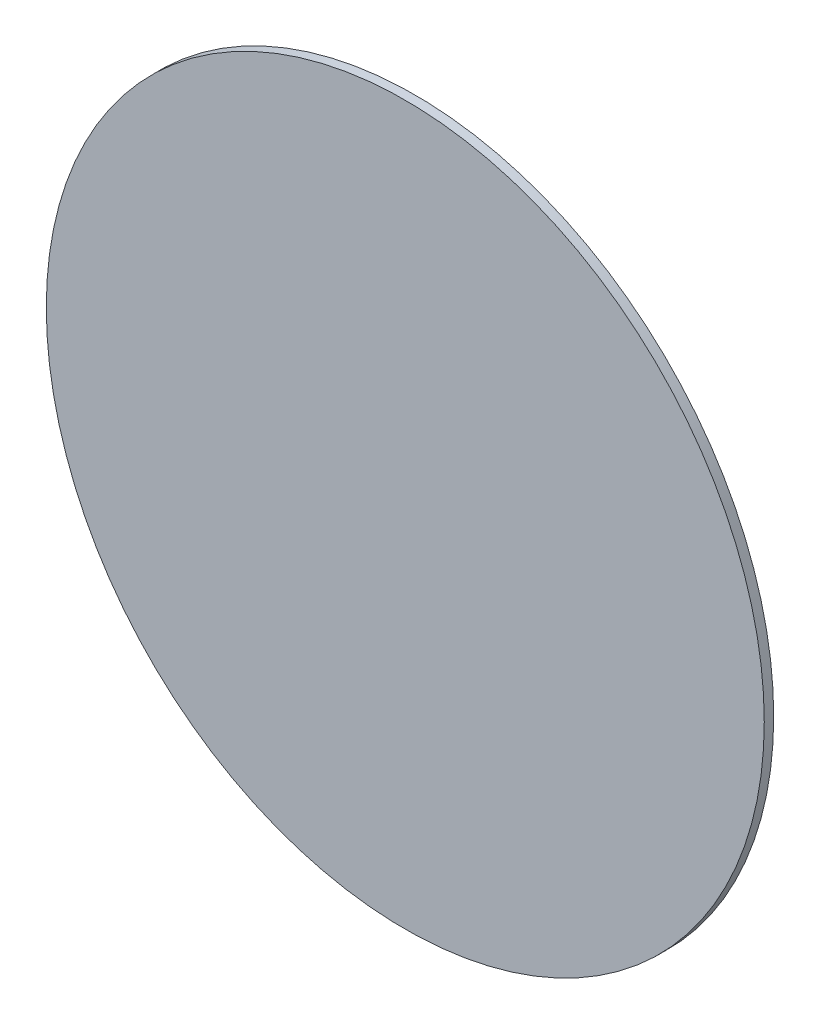
ISO-10303-21;
HEADER;
FILE_DESCRIPTION(('STEP AP214'),'2;1');
FILE_NAME('part.step','',(''),(''),'','','');
FILE_SCHEMA(('AUTOMOTIVE_DESIGN { 1 0 10303 214 1 1 1 1 }'));
ENDSEC;
DATA;
#1=APPLICATION_CONTEXT('core data for automotive mechanical design processes');
#2=APPLICATION_PROTOCOL_DEFINITION('international standard','automotive_design',2000,#1);
#3=PRODUCT_CONTEXT('',#1,'mechanical');
#4=PRODUCT('Part','Part','',(#3));
#5=PRODUCT_RELATED_PRODUCT_CATEGORY('part','',(#4));
#6=PRODUCT_DEFINITION_FORMATION('','',#4);
#7=PRODUCT_DEFINITION_CONTEXT('part definition',#1,'design');
#8=PRODUCT_DEFINITION('design','',#6,#7);
#9=PRODUCT_DEFINITION_SHAPE('','',#8);
#10=(LENGTH_UNIT() NAMED_UNIT(*) SI_UNIT(.MILLI.,.METRE.));
#11=(NAMED_UNIT(*) PLANE_ANGLE_UNIT() SI_UNIT($,.RADIAN.));
#12=(NAMED_UNIT(*) SI_UNIT($,.STERADIAN.) SOLID_ANGLE_UNIT());
#13=UNCERTAINTY_MEASURE_WITH_UNIT(LENGTH_MEASURE(1.E-05),#10,'distance_accuracy_value','');
#14=(GEOMETRIC_REPRESENTATION_CONTEXT(3) GLOBAL_UNCERTAINTY_ASSIGNED_CONTEXT((#13)) GLOBAL_UNIT_ASSIGNED_CONTEXT((#10,
#11,#12)) REPRESENTATION_CONTEXT('',''));
#15=CARTESIAN_POINT('',(0.,0.,0.));
#16=DIRECTION('',(0.,0.,1.));
#17=DIRECTION('',(1.,0.,0.));
#18=AXIS2_PLACEMENT_3D('',#15,#16,#17);
#19=CARTESIAN_POINT('',(0.,0.,5.));
#20=DIRECTION('',(0.,0.,-1.));
#21=DIRECTION('',(-1.,0.,0.));
#22=AXIS2_PLACEMENT_3D('',#19,#20,#21);
#23=CYLINDRICAL_SURFACE('',#22,190.);
#24=CARTESIAN_POINT('',(0.,0.,5.));
#25=DIRECTION('',(0.,0.,1.));
#26=DIRECTION('',(1.,0.,0.));
#27=AXIS2_PLACEMENT_3D('',#24,#25,#26);
#28=CIRCLE('',#27,190.);
#29=CARTESIAN_POINT('',(190.,0.,5.));
#30=VERTEX_POINT('',#29);
#31=EDGE_CURVE('E10',#30,#30,#28,.T.);
#32=ORIENTED_EDGE('',*,*,#31,.F.);
#33=EDGE_LOOP('',(#32));
#34=FACE_BOUND('',#33,.T.);
#35=CARTESIAN_POINT('',(0.,0.,0.));
#36=DIRECTION('',(0.,0.,1.));
#37=DIRECTION('',(1.,0.,0.));
#38=AXIS2_PLACEMENT_3D('',#35,#36,#37);
#39=CIRCLE('',#38,190.);
#40=CARTESIAN_POINT('',(190.,0.,0.));
#41=VERTEX_POINT('',#40);
#42=EDGE_CURVE('E31',#41,#41,#39,.T.);
#43=ORIENTED_EDGE('',*,*,#42,.T.);
#44=EDGE_LOOP('',(#43));
#45=FACE_BOUND('',#44,.T.);
#46=ADVANCED_FACE('F28',(#34,#45),#23,.T.);
#47=CARTESIAN_POINT('',(0.,0.,5.));
#48=DIRECTION('',(0.,0.,1.));
#49=DIRECTION('',(1.,0.,0.));
#50=AXIS2_PLACEMENT_3D('',#47,#48,#49);
#51=PLANE('',#50);
#52=ORIENTED_EDGE('',*,*,#31,.T.);
#53=EDGE_LOOP('',(#52));
#54=FACE_BOUND('',#53,.T.);
#55=ADVANCED_FACE('F43',(#54),#51,.T.);
#56=CARTESIAN_POINT('',(0.,0.,0.));
#57=DIRECTION('',(0.,0.,1.));
#58=DIRECTION('',(1.,0.,0.));
#59=AXIS2_PLACEMENT_3D('',#56,#57,#58);
#60=PLANE('',#59);
#61=ORIENTED_EDGE('',*,*,#42,.F.);
#62=EDGE_LOOP('',(#61));
#63=FACE_BOUND('',#62,.T.);
#64=ADVANCED_FACE('F41',(#63),#60,.F.);
#65=CLOSED_SHELL('',(#46,#55,#64));
#66=MANIFOLD_SOLID_BREP('B2',#65);
#67=ADVANCED_BREP_SHAPE_REPRESENTATION('',(#18,#66),#14);
#68=SHAPE_DEFINITION_REPRESENTATION(#9,#67);
ENDSEC;
END-ISO-10303-21;
